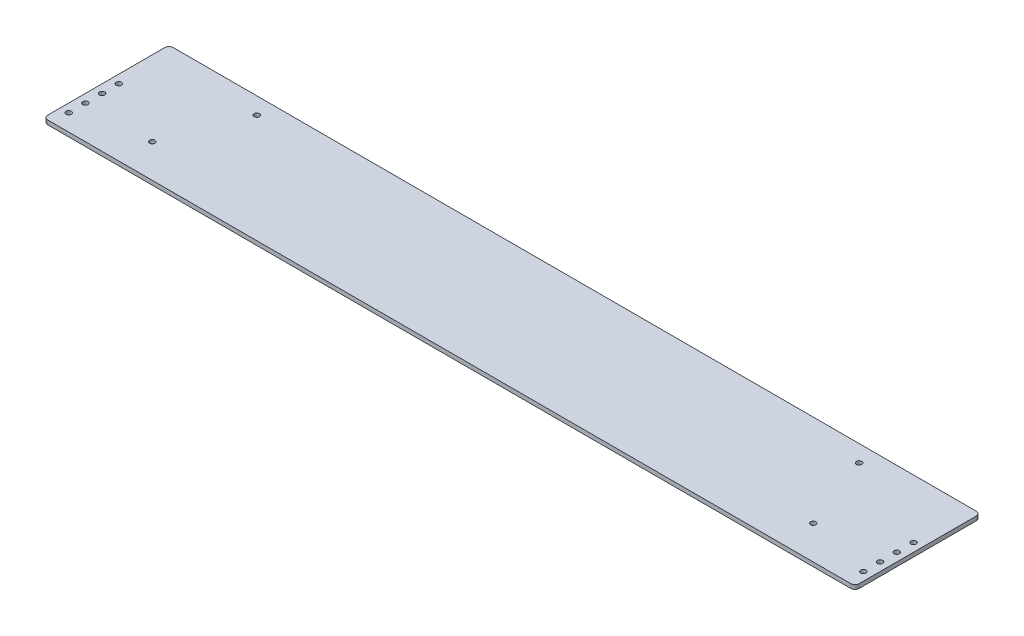
ISO-10303-21;
HEADER;
FILE_DESCRIPTION(('STEP AP214'),'2;1');
FILE_NAME('part.step','',(''),(''),'','','');
FILE_SCHEMA(('AUTOMOTIVE_DESIGN { 1 0 10303 214 1 1 1 1 }'));
ENDSEC;
DATA;
#1=APPLICATION_CONTEXT('core data for automotive mechanical design processes');
#2=APPLICATION_PROTOCOL_DEFINITION('international standard','automotive_design',2000,#1);
#3=PRODUCT_CONTEXT('',#1,'mechanical');
#4=PRODUCT('Part','Part','',(#3));
#5=PRODUCT_RELATED_PRODUCT_CATEGORY('part','',(#4));
#6=PRODUCT_DEFINITION_FORMATION('','',#4);
#7=PRODUCT_DEFINITION_CONTEXT('part definition',#1,'design');
#8=PRODUCT_DEFINITION('design','',#6,#7);
#9=PRODUCT_DEFINITION_SHAPE('','',#8);
#10=(LENGTH_UNIT() NAMED_UNIT(*) SI_UNIT(.MILLI.,.METRE.));
#11=(NAMED_UNIT(*) PLANE_ANGLE_UNIT() SI_UNIT($,.RADIAN.));
#12=(NAMED_UNIT(*) SI_UNIT($,.STERADIAN.) SOLID_ANGLE_UNIT());
#13=UNCERTAINTY_MEASURE_WITH_UNIT(LENGTH_MEASURE(1.E-05),#10,'distance_accuracy_value','');
#14=(GEOMETRIC_REPRESENTATION_CONTEXT(3) GLOBAL_UNCERTAINTY_ASSIGNED_CONTEXT((#13)) GLOBAL_UNIT_ASSIGNED_CONTEXT((#10,
#11,#12)) REPRESENTATION_CONTEXT('',''));
#15=CARTESIAN_POINT('',(0.,0.,0.));
#16=DIRECTION('',(0.,0.,1.));
#17=DIRECTION('',(1.,0.,0.));
#18=AXIS2_PLACEMENT_3D('',#15,#16,#17);
#19=CARTESIAN_POINT('',(0.,3.175,0.));
#20=DIRECTION('',(0.,-1.,0.));
#21=DIRECTION('',(0.,0.,-1.));
#22=AXIS2_PLACEMENT_3D('',#19,#20,#21);
#23=PLANE('',#22);
#24=CARTESIAN_POINT('',(228.6,3.175,-34.9250000000001));
#25=DIRECTION('',(0.,1.,0.));
#26=DIRECTION('',(0.,0.,-1.));
#27=AXIS2_PLACEMENT_3D('',#24,#25,#26);
#28=CIRCLE('',#27,2.01930000000001);
#29=CARTESIAN_POINT('',(228.6,3.175,-36.9443000000001));
#30=VERTEX_POINT('',#29);
#31=EDGE_CURVE('E289',#30,#30,#28,.T.);
#32=ORIENTED_EDGE('',*,*,#31,.F.);
#33=EDGE_LOOP('',(#32));
#34=FACE_BOUND('',#33,.T.);
#35=CARTESIAN_POINT('',(250.825,3.175,22.2249999999999));
#36=DIRECTION('',(0.,1.,0.));
#37=DIRECTION('',(0.,0.,-1.));
#38=AXIS2_PLACEMENT_3D('',#35,#36,#37);
#39=CIRCLE('',#38,2.01929999999998);
#40=CARTESIAN_POINT('',(250.825,3.175,20.2057));
#41=VERTEX_POINT('',#40);
#42=EDGE_CURVE('E297',#41,#41,#39,.T.);
#43=ORIENTED_EDGE('',*,*,#42,.F.);
#44=EDGE_LOOP('',(#43));
#45=FACE_BOUND('',#44,.T.);
#46=CARTESIAN_POINT('',(-250.825,3.175,22.225));
#47=DIRECTION('',(0.,1.,0.));
#48=DIRECTION('',(0.,0.,1.));
#49=AXIS2_PLACEMENT_3D('',#46,#47,#48);
#50=CIRCLE('',#49,2.01930000000001);
#51=CARTESIAN_POINT('',(-250.825,3.175,24.2443));
#52=VERTEX_POINT('',#51);
#53=EDGE_CURVE('E281',#52,#52,#50,.T.);
#54=ORIENTED_EDGE('',*,*,#53,.F.);
#55=EDGE_LOOP('',(#54));
#56=FACE_BOUND('',#55,.T.);
#57=CARTESIAN_POINT('',(-228.6,3.175,-34.925));
#58=DIRECTION('',(0.,1.,0.));
#59=DIRECTION('',(0.,0.,1.));
#60=AXIS2_PLACEMENT_3D('',#57,#58,#59);
#61=CIRCLE('',#60,2.01930000000001);
#62=CARTESIAN_POINT('',(-228.6,3.175,-32.9057));
#63=VERTEX_POINT('',#62);
#64=EDGE_CURVE('E277',#63,#63,#61,.T.);
#65=ORIENTED_EDGE('',*,*,#64,.F.);
#66=EDGE_LOOP('',(#65));
#67=FACE_BOUND('',#66,.T.);
#68=DIRECTION('',(1.,0.,0.));
#69=VECTOR('',#68,1.);
#70=CARTESIAN_POINT('',(-307.975,3.175,47.625));
#71=LINE('',#70,#69);
#72=CARTESIAN_POINT('',(-304.8,3.175,47.625));
#73=VERTEX_POINT('',#72);
#74=CARTESIAN_POINT('',(304.8,3.175,47.6249999999999));
#75=VERTEX_POINT('',#74);
#76=EDGE_CURVE('E155',#73,#75,#71,.T.);
#77=ORIENTED_EDGE('',*,*,#76,.T.);
#78=CARTESIAN_POINT('',(304.8,3.175,44.4499999999999));
#79=DIRECTION('',(0.,-1.,0.));
#80=DIRECTION('',(0.,0.,-1.));
#81=AXIS2_PLACEMENT_3D('',#78,#79,#80);
#82=CIRCLE('',#81,3.175);
#83=CARTESIAN_POINT('',(307.975,3.175,44.4499999999999));
#84=VERTEX_POINT('',#83);
#85=EDGE_CURVE('E184',#75,#84,#82,.F.);
#86=ORIENTED_EDGE('',*,*,#85,.T.);
#87=DIRECTION('',(0.,0.,-1.));
#88=VECTOR('',#87,1.);
#89=CARTESIAN_POINT('',(307.975,3.175,47.6249999999999));
#90=LINE('',#89,#88);
#91=CARTESIAN_POINT('',(307.975,3.175,-44.45));
#92=VERTEX_POINT('',#91);
#93=EDGE_CURVE('E133',#84,#92,#90,.T.);
#94=ORIENTED_EDGE('',*,*,#93,.T.);
#95=CARTESIAN_POINT('',(304.8,3.175,-44.45));
#96=DIRECTION('',(0.,-1.,0.));
#97=DIRECTION('',(0.,0.,-1.));
#98=AXIS2_PLACEMENT_3D('',#95,#96,#97);
#99=CIRCLE('',#98,3.175);
#100=CARTESIAN_POINT('',(304.8,3.175,-47.625));
#101=VERTEX_POINT('',#100);
#102=EDGE_CURVE('E179',#92,#101,#99,.F.);
#103=ORIENTED_EDGE('',*,*,#102,.T.);
#104=DIRECTION('',(-1.,0.,0.));
#105=VECTOR('',#104,1.);
#106=CARTESIAN_POINT('',(-307.975,3.175,-47.625));
#107=LINE('',#106,#105);
#108=CARTESIAN_POINT('',(-304.8,3.175,-47.625));
#109=VERTEX_POINT('',#108);
#110=EDGE_CURVE('E199',#101,#109,#107,.T.);
#111=ORIENTED_EDGE('',*,*,#110,.T.);
#112=CARTESIAN_POINT('',(-304.8,3.175,-44.45));
#113=DIRECTION('',(0.,-1.,0.));
#114=DIRECTION('',(0.,0.,-1.));
#115=AXIS2_PLACEMENT_3D('',#112,#113,#114);
#116=CIRCLE('',#115,3.175);
#117=CARTESIAN_POINT('',(-307.975,3.175,-44.45));
#118=VERTEX_POINT('',#117);
#119=EDGE_CURVE('E68',#109,#118,#116,.F.);
#120=ORIENTED_EDGE('',*,*,#119,.T.);
#121=DIRECTION('',(0.,0.,1.));
#122=VECTOR('',#121,1.);
#123=CARTESIAN_POINT('',(-307.975,3.175,47.625));
#124=LINE('',#123,#122);
#125=CARTESIAN_POINT('',(-307.975,3.175,44.45));
#126=VERTEX_POINT('',#125);
#127=EDGE_CURVE('E207',#118,#126,#124,.T.);
#128=ORIENTED_EDGE('',*,*,#127,.T.);
#129=CARTESIAN_POINT('',(-304.8,3.175,44.45));
#130=DIRECTION('',(0.,-1.,0.));
#131=DIRECTION('',(0.,0.,-1.));
#132=AXIS2_PLACEMENT_3D('',#129,#130,#131);
#133=CIRCLE('',#132,3.175);
#134=EDGE_CURVE('E176',#126,#73,#133,.F.);
#135=ORIENTED_EDGE('',*,*,#134,.T.);
#136=EDGE_LOOP('',(#77,#86,#94,#103,#111,#120,#128,#135));
#137=FACE_BOUND('',#136,.T.);
#138=CARTESIAN_POINT('',(-301.625,3.175,-3.17500000000002));
#139=DIRECTION('',(0.,1.,0.));
#140=DIRECTION('',(0.,0.,1.));
#141=AXIS2_PLACEMENT_3D('',#138,#139,#140);
#142=CIRCLE('',#141,2.01929999999998);
#143=CARTESIAN_POINT('',(-301.625,3.175,-1.15570000000004));
#144=VERTEX_POINT('',#143);
#145=EDGE_CURVE('E144',#144,#144,#142,.T.);
#146=ORIENTED_EDGE('',*,*,#145,.F.);
#147=EDGE_LOOP('',(#146));
#148=FACE_BOUND('',#147,.T.);
#149=CARTESIAN_POINT('',(-301.625,3.175,9.52499999999998));
#150=DIRECTION('',(0.,1.,0.));
#151=DIRECTION('',(0.,0.,1.));
#152=AXIS2_PLACEMENT_3D('',#149,#150,#151);
#153=CIRCLE('',#152,2.01929999999998);
#154=CARTESIAN_POINT('',(-301.625,3.175,11.5443));
#155=VERTEX_POINT('',#154);
#156=EDGE_CURVE('E219',#155,#155,#153,.T.);
#157=ORIENTED_EDGE('',*,*,#156,.F.);
#158=EDGE_LOOP('',(#157));
#159=FACE_BOUND('',#158,.T.);
#160=CARTESIAN_POINT('',(-301.625,3.175,22.225));
#161=DIRECTION('',(0.,1.,0.));
#162=DIRECTION('',(0.,0.,1.));
#163=AXIS2_PLACEMENT_3D('',#160,#161,#162);
#164=CIRCLE('',#163,2.01929999999998);
#165=CARTESIAN_POINT('',(-301.625,3.175,24.2443));
#166=VERTEX_POINT('',#165);
#167=EDGE_CURVE('E225',#166,#166,#164,.T.);
#168=ORIENTED_EDGE('',*,*,#167,.F.);
#169=EDGE_LOOP('',(#168));
#170=FACE_BOUND('',#169,.T.);
#171=CARTESIAN_POINT('',(-301.625,3.175,34.925));
#172=DIRECTION('',(0.,1.,0.));
#173=DIRECTION('',(0.,0.,1.));
#174=AXIS2_PLACEMENT_3D('',#171,#172,#173);
#175=CIRCLE('',#174,2.01929999999998);
#176=CARTESIAN_POINT('',(-301.625,3.175,36.9443));
#177=VERTEX_POINT('',#176);
#178=EDGE_CURVE('E233',#177,#177,#175,.T.);
#179=ORIENTED_EDGE('',*,*,#178,.F.);
#180=EDGE_LOOP('',(#179));
#181=FACE_BOUND('',#180,.T.);
#182=CARTESIAN_POINT('',(301.625,3.175,34.9249999999999));
#183=DIRECTION('',(0.,1.,0.));
#184=DIRECTION('',(0.,0.,-1.));
#185=AXIS2_PLACEMENT_3D('',#182,#183,#184);
#186=CIRCLE('',#185,2.01929999999998);
#187=CARTESIAN_POINT('',(301.625,3.175,32.9056999999999));
#188=VERTEX_POINT('',#187);
#189=EDGE_CURVE('E241',#188,#188,#186,.T.);
#190=ORIENTED_EDGE('',*,*,#189,.F.);
#191=EDGE_LOOP('',(#190));
#192=FACE_BOUND('',#191,.T.);
#193=CARTESIAN_POINT('',(301.625,3.175,22.2249999999999));
#194=DIRECTION('',(0.,1.,0.));
#195=DIRECTION('',(0.,0.,-1.));
#196=AXIS2_PLACEMENT_3D('',#193,#194,#195);
#197=CIRCLE('',#196,2.01929999999998);
#198=CARTESIAN_POINT('',(301.625,3.175,20.2056999999999));
#199=VERTEX_POINT('',#198);
#200=EDGE_CURVE('E249',#199,#199,#197,.T.);
#201=ORIENTED_EDGE('',*,*,#200,.F.);
#202=EDGE_LOOP('',(#201));
#203=FACE_BOUND('',#202,.T.);
#204=CARTESIAN_POINT('',(301.625,3.175,9.52499999999991));
#205=DIRECTION('',(0.,1.,0.));
#206=DIRECTION('',(0.,0.,-1.));
#207=AXIS2_PLACEMENT_3D('',#204,#205,#206);
#208=CIRCLE('',#207,2.01929999999998);
#209=CARTESIAN_POINT('',(301.625,3.175,7.50569999999993));
#210=VERTEX_POINT('',#209);
#211=EDGE_CURVE('E257',#210,#210,#208,.T.);
#212=ORIENTED_EDGE('',*,*,#211,.F.);
#213=EDGE_LOOP('',(#212));
#214=FACE_BOUND('',#213,.T.);
#215=CARTESIAN_POINT('',(301.625,3.175,-3.17500000000009));
#216=DIRECTION('',(0.,1.,0.));
#217=DIRECTION('',(0.,0.,-1.));
#218=AXIS2_PLACEMENT_3D('',#215,#216,#217);
#219=CIRCLE('',#218,2.01929999999998);
#220=CARTESIAN_POINT('',(301.625,3.175,-5.19430000000007));
#221=VERTEX_POINT('',#220);
#222=EDGE_CURVE('E265',#221,#221,#219,.T.);
#223=ORIENTED_EDGE('',*,*,#222,.F.);
#224=EDGE_LOOP('',(#223));
#225=FACE_BOUND('',#224,.T.);
#226=ADVANCED_FACE('F45',(#34,#45,#56,#67,#137,#148,#159,#170,#181,#192,#203,#214,#225),#23,.F.);
#227=CARTESIAN_POINT('',(0.,0.,0.));
#228=DIRECTION('',(0.,-1.,0.));
#229=DIRECTION('',(0.,0.,-1.));
#230=AXIS2_PLACEMENT_3D('',#227,#228,#229);
#231=PLANE('',#230);
#232=CARTESIAN_POINT('',(228.6,0.,-34.9250000000001));
#233=DIRECTION('',(0.,1.,0.));
#234=DIRECTION('',(0.,0.,-1.));
#235=AXIS2_PLACEMENT_3D('',#232,#233,#234);
#236=CIRCLE('',#235,2.01930000000001);
#237=CARTESIAN_POINT('',(228.6,0.,-36.9443000000001));
#238=VERTEX_POINT('',#237);
#239=EDGE_CURVE('E285',#238,#238,#236,.T.);
#240=ORIENTED_EDGE('',*,*,#239,.T.);
#241=EDGE_LOOP('',(#240));
#242=FACE_BOUND('',#241,.T.);
#243=CARTESIAN_POINT('',(250.825,0.,22.2249999999999));
#244=DIRECTION('',(0.,1.,0.));
#245=DIRECTION('',(0.,0.,-1.));
#246=AXIS2_PLACEMENT_3D('',#243,#244,#245);
#247=CIRCLE('',#246,2.01929999999998);
#248=CARTESIAN_POINT('',(250.825,0.,20.2057));
#249=VERTEX_POINT('',#248);
#250=EDGE_CURVE('E293',#249,#249,#247,.T.);
#251=ORIENTED_EDGE('',*,*,#250,.T.);
#252=EDGE_LOOP('',(#251));
#253=FACE_BOUND('',#252,.T.);
#254=CARTESIAN_POINT('',(-250.825,0.,22.225));
#255=DIRECTION('',(0.,1.,0.));
#256=DIRECTION('',(0.,0.,1.));
#257=AXIS2_PLACEMENT_3D('',#254,#255,#256);
#258=CIRCLE('',#257,2.01930000000001);
#259=CARTESIAN_POINT('',(-250.825,0.,24.2443));
#260=VERTEX_POINT('',#259);
#261=EDGE_CURVE('E301',#260,#260,#258,.T.);
#262=ORIENTED_EDGE('',*,*,#261,.T.);
#263=EDGE_LOOP('',(#262));
#264=FACE_BOUND('',#263,.T.);
#265=CARTESIAN_POINT('',(-228.6,0.,-34.925));
#266=DIRECTION('',(0.,1.,0.));
#267=DIRECTION('',(0.,0.,1.));
#268=AXIS2_PLACEMENT_3D('',#265,#266,#267);
#269=CIRCLE('',#268,2.01930000000001);
#270=CARTESIAN_POINT('',(-228.6,0.,-32.9057));
#271=VERTEX_POINT('',#270);
#272=EDGE_CURVE('E273',#271,#271,#269,.T.);
#273=ORIENTED_EDGE('',*,*,#272,.T.);
#274=EDGE_LOOP('',(#273));
#275=FACE_BOUND('',#274,.T.);
#276=CARTESIAN_POINT('',(301.625,0.,9.52499999999991));
#277=DIRECTION('',(0.,1.,0.));
#278=DIRECTION('',(0.,0.,-1.));
#279=AXIS2_PLACEMENT_3D('',#276,#277,#278);
#280=CIRCLE('',#279,2.01929999999998);
#281=CARTESIAN_POINT('',(301.625,0.,7.50569999999993));
#282=VERTEX_POINT('',#281);
#283=EDGE_CURVE('E261',#282,#282,#280,.T.);
#284=ORIENTED_EDGE('',*,*,#283,.T.);
#285=EDGE_LOOP('',(#284));
#286=FACE_BOUND('',#285,.T.);
#287=CARTESIAN_POINT('',(301.625,0.,34.9249999999999));
#288=DIRECTION('',(0.,1.,0.));
#289=DIRECTION('',(0.,0.,-1.));
#290=AXIS2_PLACEMENT_3D('',#287,#288,#289);
#291=CIRCLE('',#290,2.01929999999998);
#292=CARTESIAN_POINT('',(301.625,0.,32.9056999999999));
#293=VERTEX_POINT('',#292);
#294=EDGE_CURVE('E245',#293,#293,#291,.T.);
#295=ORIENTED_EDGE('',*,*,#294,.T.);
#296=EDGE_LOOP('',(#295));
#297=FACE_BOUND('',#296,.T.);
#298=CARTESIAN_POINT('',(-301.625,0.,22.225));
#299=DIRECTION('',(0.,1.,0.));
#300=DIRECTION('',(0.,0.,1.));
#301=AXIS2_PLACEMENT_3D('',#298,#299,#300);
#302=CIRCLE('',#301,2.01929999999998);
#303=CARTESIAN_POINT('',(-301.625,0.,24.2443));
#304=VERTEX_POINT('',#303);
#305=EDGE_CURVE('E229',#304,#304,#302,.T.);
#306=ORIENTED_EDGE('',*,*,#305,.T.);
#307=EDGE_LOOP('',(#306));
#308=FACE_BOUND('',#307,.T.);
#309=CARTESIAN_POINT('',(-301.625,0.,-3.17500000000002));
#310=DIRECTION('',(0.,1.,0.));
#311=DIRECTION('',(0.,0.,1.));
#312=AXIS2_PLACEMENT_3D('',#309,#310,#311);
#313=CIRCLE('',#312,2.01929999999998);
#314=CARTESIAN_POINT('',(-301.625,0.,-1.15570000000004));
#315=VERTEX_POINT('',#314);
#316=EDGE_CURVE('E152',#315,#315,#313,.T.);
#317=ORIENTED_EDGE('',*,*,#316,.T.);
#318=EDGE_LOOP('',(#317));
#319=FACE_BOUND('',#318,.T.);
#320=DIRECTION('',(0.,0.,-1.));
#321=VECTOR('',#320,1.);
#322=CARTESIAN_POINT('',(307.975,0.,47.6249999999999));
#323=LINE('',#322,#321);
#324=CARTESIAN_POINT('',(307.975,0.,44.4499999999999));
#325=VERTEX_POINT('',#324);
#326=CARTESIAN_POINT('',(307.975,0.,-44.45));
#327=VERTEX_POINT('',#326);
#328=EDGE_CURVE('E130',#325,#327,#323,.T.);
#329=ORIENTED_EDGE('',*,*,#328,.F.);
#330=CARTESIAN_POINT('',(304.8,0.,44.4499999999999));
#331=DIRECTION('',(0.,-1.,0.));
#332=DIRECTION('',(0.,0.,-1.));
#333=AXIS2_PLACEMENT_3D('',#330,#331,#332);
#334=CIRCLE('',#333,3.175);
#335=CARTESIAN_POINT('',(304.8,0.,47.6249999999999));
#336=VERTEX_POINT('',#335);
#337=EDGE_CURVE('E112',#325,#336,#334,.T.);
#338=ORIENTED_EDGE('',*,*,#337,.T.);
#339=DIRECTION('',(1.,0.,0.));
#340=VECTOR('',#339,1.);
#341=CARTESIAN_POINT('',(-307.975,0.,47.625));
#342=LINE('',#341,#340);
#343=CARTESIAN_POINT('',(-304.8,0.,47.625));
#344=VERTEX_POINT('',#343);
#345=EDGE_CURVE('E160',#344,#336,#342,.T.);
#346=ORIENTED_EDGE('',*,*,#345,.F.);
#347=CARTESIAN_POINT('',(-304.8,0.,44.45));
#348=DIRECTION('',(0.,-1.,0.));
#349=DIRECTION('',(0.,0.,-1.));
#350=AXIS2_PLACEMENT_3D('',#347,#348,#349);
#351=CIRCLE('',#350,3.175);
#352=CARTESIAN_POINT('',(-307.975,0.,44.45));
#353=VERTEX_POINT('',#352);
#354=EDGE_CURVE('E135',#344,#353,#351,.T.);
#355=ORIENTED_EDGE('',*,*,#354,.T.);
#356=DIRECTION('',(0.,0.,1.));
#357=VECTOR('',#356,1.);
#358=CARTESIAN_POINT('',(-307.975,0.,47.625));
#359=LINE('',#358,#357);
#360=CARTESIAN_POINT('',(-307.975,0.,-44.45));
#361=VERTEX_POINT('',#360);
#362=EDGE_CURVE('E149',#361,#353,#359,.T.);
#363=ORIENTED_EDGE('',*,*,#362,.F.);
#364=CARTESIAN_POINT('',(-304.8,0.,-44.45));
#365=DIRECTION('',(0.,-1.,0.));
#366=DIRECTION('',(0.,0.,-1.));
#367=AXIS2_PLACEMENT_3D('',#364,#365,#366);
#368=CIRCLE('',#367,3.175);
#369=CARTESIAN_POINT('',(-304.8,0.,-47.625));
#370=VERTEX_POINT('',#369);
#371=EDGE_CURVE('E124',#361,#370,#368,.T.);
#372=ORIENTED_EDGE('',*,*,#371,.T.);
#373=DIRECTION('',(-1.,0.,0.));
#374=VECTOR('',#373,1.);
#375=CARTESIAN_POINT('',(-307.975,0.,-47.625));
#376=LINE('',#375,#374);
#377=CARTESIAN_POINT('',(304.8,0.,-47.625));
#378=VERTEX_POINT('',#377);
#379=EDGE_CURVE('E143',#378,#370,#376,.T.);
#380=ORIENTED_EDGE('',*,*,#379,.F.);
#381=CARTESIAN_POINT('',(304.8,0.,-44.45));
#382=DIRECTION('',(0.,-1.,0.));
#383=DIRECTION('',(0.,0.,-1.));
#384=AXIS2_PLACEMENT_3D('',#381,#382,#383);
#385=CIRCLE('',#384,3.175);
#386=EDGE_CURVE('E141',#378,#327,#385,.T.);
#387=ORIENTED_EDGE('',*,*,#386,.T.);
#388=EDGE_LOOP('',(#329,#338,#346,#355,#363,#372,#380,#387));
#389=FACE_BOUND('',#388,.T.);
#390=CARTESIAN_POINT('',(-301.625,0.,9.52499999999998));
#391=DIRECTION('',(0.,1.,0.));
#392=DIRECTION('',(0.,0.,1.));
#393=AXIS2_PLACEMENT_3D('',#390,#391,#392);
#394=CIRCLE('',#393,2.01929999999998);
#395=CARTESIAN_POINT('',(-301.625,0.,11.5443));
#396=VERTEX_POINT('',#395);
#397=EDGE_CURVE('E221',#396,#396,#394,.T.);
#398=ORIENTED_EDGE('',*,*,#397,.T.);
#399=EDGE_LOOP('',(#398));
#400=FACE_BOUND('',#399,.T.);
#401=CARTESIAN_POINT('',(-301.625,0.,34.925));
#402=DIRECTION('',(0.,1.,0.));
#403=DIRECTION('',(0.,0.,1.));
#404=AXIS2_PLACEMENT_3D('',#401,#402,#403);
#405=CIRCLE('',#404,2.01929999999998);
#406=CARTESIAN_POINT('',(-301.625,0.,36.9443));
#407=VERTEX_POINT('',#406);
#408=EDGE_CURVE('E237',#407,#407,#405,.T.);
#409=ORIENTED_EDGE('',*,*,#408,.T.);
#410=EDGE_LOOP('',(#409));
#411=FACE_BOUND('',#410,.T.);
#412=CARTESIAN_POINT('',(301.625,0.,22.2249999999999));
#413=DIRECTION('',(0.,1.,0.));
#414=DIRECTION('',(0.,0.,-1.));
#415=AXIS2_PLACEMENT_3D('',#412,#413,#414);
#416=CIRCLE('',#415,2.01929999999998);
#417=CARTESIAN_POINT('',(301.625,0.,20.2056999999999));
#418=VERTEX_POINT('',#417);
#419=EDGE_CURVE('E253',#418,#418,#416,.T.);
#420=ORIENTED_EDGE('',*,*,#419,.T.);
#421=EDGE_LOOP('',(#420));
#422=FACE_BOUND('',#421,.T.);
#423=CARTESIAN_POINT('',(301.625,0.,-3.17500000000009));
#424=DIRECTION('',(0.,1.,0.));
#425=DIRECTION('',(0.,0.,-1.));
#426=AXIS2_PLACEMENT_3D('',#423,#424,#425);
#427=CIRCLE('',#426,2.01929999999998);
#428=CARTESIAN_POINT('',(301.625,0.,-5.19430000000007));
#429=VERTEX_POINT('',#428);
#430=EDGE_CURVE('E269',#429,#429,#427,.T.);
#431=ORIENTED_EDGE('',*,*,#430,.T.);
#432=EDGE_LOOP('',(#431));
#433=FACE_BOUND('',#432,.T.);
#434=ADVANCED_FACE('F138',(#242,#253,#264,#275,#286,#297,#308,#319,#389,#400,#411,#422,#433),
#231,.T.);
#435=CARTESIAN_POINT('',(307.975,3.175,47.6249999999999));
#436=DIRECTION('',(-1.,0.,0.));
#437=DIRECTION('',(0.,0.,1.));
#438=AXIS2_PLACEMENT_3D('',#435,#436,#437);
#439=PLANE('',#438);
#440=ORIENTED_EDGE('',*,*,#93,.F.);
#441=DIRECTION('',(0.,-1.,0.));
#442=VECTOR('',#441,1.);
#443=CARTESIAN_POINT('',(307.975,3.175,44.4499999999999));
#444=LINE('',#443,#442);
#445=EDGE_CURVE('E116',#84,#325,#444,.T.);
#446=ORIENTED_EDGE('',*,*,#445,.T.);
#447=ORIENTED_EDGE('',*,*,#328,.T.);
#448=DIRECTION('',(0.,-1.,0.));
#449=VECTOR('',#448,1.);
#450=CARTESIAN_POINT('',(307.975,3.175,-44.45));
#451=LINE('',#450,#449);
#452=EDGE_CURVE('E136',#327,#92,#451,.F.);
#453=ORIENTED_EDGE('',*,*,#452,.T.);
#454=EDGE_LOOP('',(#440,#446,#447,#453));
#455=FACE_BOUND('',#454,.T.);
#456=ADVANCED_FACE('F129',(#455),#439,.F.);
#457=CARTESIAN_POINT('',(-307.975,3.175,-47.625));
#458=DIRECTION('',(0.,0.,1.));
#459=DIRECTION('',(1.,0.,0.));
#460=AXIS2_PLACEMENT_3D('',#457,#458,#459);
#461=PLANE('',#460);
#462=ORIENTED_EDGE('',*,*,#379,.T.);
#463=DIRECTION('',(0.,-1.,0.));
#464=VECTOR('',#463,1.);
#465=CARTESIAN_POINT('',(-304.8,3.175,-47.625));
#466=LINE('',#465,#464);
#467=EDGE_CURVE('E11',#370,#109,#466,.F.);
#468=ORIENTED_EDGE('',*,*,#467,.T.);
#469=ORIENTED_EDGE('',*,*,#110,.F.);
#470=DIRECTION('',(0.,-1.,0.));
#471=VECTOR('',#470,1.);
#472=CARTESIAN_POINT('',(304.8,3.175,-47.625));
#473=LINE('',#472,#471);
#474=EDGE_CURVE('E54',#101,#378,#473,.T.);
#475=ORIENTED_EDGE('',*,*,#474,.T.);
#476=EDGE_LOOP('',(#462,#468,#469,#475));
#477=FACE_BOUND('',#476,.T.);
#478=ADVANCED_FACE('F197',(#477),#461,.F.);
#479=CARTESIAN_POINT('',(-307.975,3.175,47.625));
#480=DIRECTION('',(1.,0.,0.));
#481=DIRECTION('',(0.,0.,-1.));
#482=AXIS2_PLACEMENT_3D('',#479,#480,#481);
#483=PLANE('',#482);
#484=ORIENTED_EDGE('',*,*,#127,.F.);
#485=DIRECTION('',(0.,-1.,0.));
#486=VECTOR('',#485,1.);
#487=CARTESIAN_POINT('',(-307.975,3.175,-44.45));
#488=LINE('',#487,#486);
#489=EDGE_CURVE('E189',#118,#361,#488,.T.);
#490=ORIENTED_EDGE('',*,*,#489,.T.);
#491=ORIENTED_EDGE('',*,*,#362,.T.);
#492=DIRECTION('',(0.,-1.,0.));
#493=VECTOR('',#492,1.);
#494=CARTESIAN_POINT('',(-307.975,3.175,44.45));
#495=LINE('',#494,#493);
#496=EDGE_CURVE('E61',#353,#126,#495,.F.);
#497=ORIENTED_EDGE('',*,*,#496,.T.);
#498=EDGE_LOOP('',(#484,#490,#491,#497));
#499=FACE_BOUND('',#498,.T.);
#500=ADVANCED_FACE('F206',(#499),#483,.F.);
#501=CARTESIAN_POINT('',(-307.975,3.175,47.625));
#502=DIRECTION('',(0.,0.,-1.));
#503=DIRECTION('',(-1.,0.,0.));
#504=AXIS2_PLACEMENT_3D('',#501,#502,#503);
#505=PLANE('',#504);
#506=ORIENTED_EDGE('',*,*,#345,.T.);
#507=DIRECTION('',(0.,-1.,0.));
#508=VECTOR('',#507,1.);
#509=CARTESIAN_POINT('',(304.8,3.175,47.6249999999999));
#510=LINE('',#509,#508);
#511=EDGE_CURVE('E117',#336,#75,#510,.F.);
#512=ORIENTED_EDGE('',*,*,#511,.T.);
#513=ORIENTED_EDGE('',*,*,#76,.F.);
#514=DIRECTION('',(0.,-1.,0.));
#515=VECTOR('',#514,1.);
#516=CARTESIAN_POINT('',(-304.8,3.175,47.625));
#517=LINE('',#516,#515);
#518=EDGE_CURVE('E123',#73,#344,#517,.T.);
#519=ORIENTED_EDGE('',*,*,#518,.T.);
#520=EDGE_LOOP('',(#506,#512,#513,#519));
#521=FACE_BOUND('',#520,.T.);
#522=ADVANCED_FACE('F352',(#521),#505,.F.);
#523=CARTESIAN_POINT('',(-301.625,3.175,-3.17500000000002));
#524=DIRECTION('',(0.,-1.,0.));
#525=DIRECTION('',(0.,0.,-1.));
#526=AXIS2_PLACEMENT_3D('',#523,#524,#525);
#527=CYLINDRICAL_SURFACE('',#526,2.01929999999998);
#528=ORIENTED_EDGE('',*,*,#145,.T.);
#529=EDGE_LOOP('',(#528));
#530=FACE_BOUND('',#529,.T.);
#531=ORIENTED_EDGE('',*,*,#316,.F.);
#532=EDGE_LOOP('',(#531));
#533=FACE_BOUND('',#532,.T.);
#534=ADVANCED_FACE('F355',(#530,#533),#527,.F.);
#535=CARTESIAN_POINT('',(-301.625,3.175,9.52499999999998));
#536=DIRECTION('',(0.,-1.,0.));
#537=DIRECTION('',(0.,0.,-1.));
#538=AXIS2_PLACEMENT_3D('',#535,#536,#537);
#539=CYLINDRICAL_SURFACE('',#538,2.01929999999998);
#540=ORIENTED_EDGE('',*,*,#156,.T.);
#541=EDGE_LOOP('',(#540));
#542=FACE_BOUND('',#541,.T.);
#543=ORIENTED_EDGE('',*,*,#397,.F.);
#544=EDGE_LOOP('',(#543));
#545=FACE_BOUND('',#544,.T.);
#546=ADVANCED_FACE('F406',(#542,#545),#539,.F.);
#547=CARTESIAN_POINT('',(-301.625,3.175,22.225));
#548=DIRECTION('',(0.,-1.,0.));
#549=DIRECTION('',(0.,0.,-1.));
#550=AXIS2_PLACEMENT_3D('',#547,#548,#549);
#551=CYLINDRICAL_SURFACE('',#550,2.01929999999998);
#552=ORIENTED_EDGE('',*,*,#167,.T.);
#553=EDGE_LOOP('',(#552));
#554=FACE_BOUND('',#553,.T.);
#555=ORIENTED_EDGE('',*,*,#305,.F.);
#556=EDGE_LOOP('',(#555));
#557=FACE_BOUND('',#556,.T.);
#558=ADVANCED_FACE('F402',(#554,#557),#551,.F.);
#559=CARTESIAN_POINT('',(-301.625,3.175,34.925));
#560=DIRECTION('',(0.,-1.,0.));
#561=DIRECTION('',(0.,0.,-1.));
#562=AXIS2_PLACEMENT_3D('',#559,#560,#561);
#563=CYLINDRICAL_SURFACE('',#562,2.01929999999998);
#564=ORIENTED_EDGE('',*,*,#178,.T.);
#565=EDGE_LOOP('',(#564));
#566=FACE_BOUND('',#565,.T.);
#567=ORIENTED_EDGE('',*,*,#408,.F.);
#568=EDGE_LOOP('',(#567));
#569=FACE_BOUND('',#568,.T.);
#570=ADVANCED_FACE('F398',(#566,#569),#563,.F.);
#571=CARTESIAN_POINT('',(301.625,3.175,34.9249999999999));
#572=DIRECTION('',(0.,-1.,0.));
#573=DIRECTION('',(0.,0.,-1.));
#574=AXIS2_PLACEMENT_3D('',#571,#572,#573);
#575=CYLINDRICAL_SURFACE('',#574,2.01929999999998);
#576=ORIENTED_EDGE('',*,*,#189,.T.);
#577=EDGE_LOOP('',(#576));
#578=FACE_BOUND('',#577,.T.);
#579=ORIENTED_EDGE('',*,*,#294,.F.);
#580=EDGE_LOOP('',(#579));
#581=FACE_BOUND('',#580,.T.);
#582=ADVANCED_FACE('F394',(#578,#581),#575,.F.);
#583=CARTESIAN_POINT('',(301.625,3.175,22.2249999999999));
#584=DIRECTION('',(0.,-1.,0.));
#585=DIRECTION('',(0.,0.,-1.));
#586=AXIS2_PLACEMENT_3D('',#583,#584,#585);
#587=CYLINDRICAL_SURFACE('',#586,2.01929999999998);
#588=ORIENTED_EDGE('',*,*,#200,.T.);
#589=EDGE_LOOP('',(#588));
#590=FACE_BOUND('',#589,.T.);
#591=ORIENTED_EDGE('',*,*,#419,.F.);
#592=EDGE_LOOP('',(#591));
#593=FACE_BOUND('',#592,.T.);
#594=ADVANCED_FACE('F390',(#590,#593),#587,.F.);
#595=CARTESIAN_POINT('',(301.625,3.175,9.52499999999991));
#596=DIRECTION('',(0.,-1.,0.));
#597=DIRECTION('',(0.,0.,-1.));
#598=AXIS2_PLACEMENT_3D('',#595,#596,#597);
#599=CYLINDRICAL_SURFACE('',#598,2.01929999999998);
#600=ORIENTED_EDGE('',*,*,#211,.T.);
#601=EDGE_LOOP('',(#600));
#602=FACE_BOUND('',#601,.T.);
#603=ORIENTED_EDGE('',*,*,#283,.F.);
#604=EDGE_LOOP('',(#603));
#605=FACE_BOUND('',#604,.T.);
#606=ADVANCED_FACE('F337',(#602,#605),#599,.F.);
#607=CARTESIAN_POINT('',(301.625,3.175,-3.17500000000009));
#608=DIRECTION('',(0.,-1.,0.));
#609=DIRECTION('',(0.,0.,-1.));
#610=AXIS2_PLACEMENT_3D('',#607,#608,#609);
#611=CYLINDRICAL_SURFACE('',#610,2.01929999999998);
#612=ORIENTED_EDGE('',*,*,#222,.T.);
#613=EDGE_LOOP('',(#612));
#614=FACE_BOUND('',#613,.T.);
#615=ORIENTED_EDGE('',*,*,#430,.F.);
#616=EDGE_LOOP('',(#615));
#617=FACE_BOUND('',#616,.T.);
#618=ADVANCED_FACE('F334',(#614,#617),#611,.F.);
#619=CARTESIAN_POINT('',(304.8,3.175,44.4499999999999));
#620=DIRECTION('',(0.,-1.,0.));
#621=DIRECTION('',(0.,0.,-1.));
#622=AXIS2_PLACEMENT_3D('',#619,#620,#621);
#623=CYLINDRICAL_SURFACE('',#622,3.175);
#624=ORIENTED_EDGE('',*,*,#85,.F.);
#625=ORIENTED_EDGE('',*,*,#511,.F.);
#626=ORIENTED_EDGE('',*,*,#337,.F.);
#627=ORIENTED_EDGE('',*,*,#445,.F.);
#628=EDGE_LOOP('',(#624,#625,#626,#627));
#629=FACE_BOUND('',#628,.T.);
#630=ADVANCED_FACE('F115',(#629),#623,.T.);
#631=CARTESIAN_POINT('',(-304.8,3.175,-44.45));
#632=DIRECTION('',(0.,-1.,0.));
#633=DIRECTION('',(0.,0.,-1.));
#634=AXIS2_PLACEMENT_3D('',#631,#632,#633);
#635=CYLINDRICAL_SURFACE('',#634,3.175);
#636=ORIENTED_EDGE('',*,*,#119,.F.);
#637=ORIENTED_EDGE('',*,*,#467,.F.);
#638=ORIENTED_EDGE('',*,*,#371,.F.);
#639=ORIENTED_EDGE('',*,*,#489,.F.);
#640=EDGE_LOOP('',(#636,#637,#638,#639));
#641=FACE_BOUND('',#640,.T.);
#642=ADVANCED_FACE('F205',(#641),#635,.T.);
#643=CARTESIAN_POINT('',(304.8,3.175,-44.45));
#644=DIRECTION('',(0.,-1.,0.));
#645=DIRECTION('',(0.,0.,-1.));
#646=AXIS2_PLACEMENT_3D('',#643,#644,#645);
#647=CYLINDRICAL_SURFACE('',#646,3.175);
#648=ORIENTED_EDGE('',*,*,#102,.F.);
#649=ORIENTED_EDGE('',*,*,#452,.F.);
#650=ORIENTED_EDGE('',*,*,#386,.F.);
#651=ORIENTED_EDGE('',*,*,#474,.F.);
#652=EDGE_LOOP('',(#648,#649,#650,#651));
#653=FACE_BOUND('',#652,.T.);
#654=ADVANCED_FACE('F364',(#653),#647,.T.);
#655=CARTESIAN_POINT('',(-304.8,3.175,44.45));
#656=DIRECTION('',(0.,-1.,0.));
#657=DIRECTION('',(0.,0.,-1.));
#658=AXIS2_PLACEMENT_3D('',#655,#656,#657);
#659=CYLINDRICAL_SURFACE('',#658,3.175);
#660=ORIENTED_EDGE('',*,*,#134,.F.);
#661=ORIENTED_EDGE('',*,*,#496,.F.);
#662=ORIENTED_EDGE('',*,*,#354,.F.);
#663=ORIENTED_EDGE('',*,*,#518,.F.);
#664=EDGE_LOOP('',(#660,#661,#662,#663));
#665=FACE_BOUND('',#664,.T.);
#666=ADVANCED_FACE('F47',(#665),#659,.T.);
#667=CARTESIAN_POINT('',(-228.6,0.,-34.925));
#668=DIRECTION('',(0.,1.,0.));
#669=DIRECTION('',(0.,0.,1.));
#670=AXIS2_PLACEMENT_3D('',#667,#668,#669);
#671=CYLINDRICAL_SURFACE('',#670,2.01930000000001);
#672=ORIENTED_EDGE('',*,*,#272,.F.);
#673=EDGE_LOOP('',(#672));
#674=FACE_BOUND('',#673,.T.);
#675=ORIENTED_EDGE('',*,*,#64,.T.);
#676=EDGE_LOOP('',(#675));
#677=FACE_BOUND('',#676,.T.);
#678=ADVANCED_FACE('F369',(#674,#677),#671,.F.);
#679=CARTESIAN_POINT('',(-250.825,0.,22.225));
#680=DIRECTION('',(0.,1.,0.));
#681=DIRECTION('',(0.,0.,1.));
#682=AXIS2_PLACEMENT_3D('',#679,#680,#681);
#683=CYLINDRICAL_SURFACE('',#682,2.01930000000001);
#684=ORIENTED_EDGE('',*,*,#261,.F.);
#685=EDGE_LOOP('',(#684));
#686=FACE_BOUND('',#685,.T.);
#687=ORIENTED_EDGE('',*,*,#53,.T.);
#688=EDGE_LOOP('',(#687));
#689=FACE_BOUND('',#688,.T.);
#690=ADVANCED_FACE('F309',(#686,#689),#683,.F.);
#691=CARTESIAN_POINT('',(250.825,0.,22.2249999999999));
#692=DIRECTION('',(0.,1.,0.));
#693=DIRECTION('',(0.,0.,1.));
#694=AXIS2_PLACEMENT_3D('',#691,#692,#693);
#695=CYLINDRICAL_SURFACE('',#694,2.01929999999998);
#696=ORIENTED_EDGE('',*,*,#250,.F.);
#697=EDGE_LOOP('',(#696));
#698=FACE_BOUND('',#697,.T.);
#699=ORIENTED_EDGE('',*,*,#42,.T.);
#700=EDGE_LOOP('',(#699));
#701=FACE_BOUND('',#700,.T.);
#702=ADVANCED_FACE('F379',(#698,#701),#695,.F.);
#703=CARTESIAN_POINT('',(228.6,0.,-34.9250000000001));
#704=DIRECTION('',(0.,1.,0.));
#705=DIRECTION('',(0.,0.,1.));
#706=AXIS2_PLACEMENT_3D('',#703,#704,#705);
#707=CYLINDRICAL_SURFACE('',#706,2.01930000000001);
#708=ORIENTED_EDGE('',*,*,#239,.F.);
#709=EDGE_LOOP('',(#708));
#710=FACE_BOUND('',#709,.T.);
#711=ORIENTED_EDGE('',*,*,#31,.T.);
#712=EDGE_LOOP('',(#711));
#713=FACE_BOUND('',#712,.T.);
#714=ADVANCED_FACE('F385',(#710,#713),#707,.F.);
#715=CLOSED_SHELL('',(#226,#434,#456,#478,#500,#522,#534,#546,#558,#570,#582,#594,#606,#618,
#630,#642,#654,#666,#678,#690,#702,#714));
#716=MANIFOLD_SOLID_BREP('B2',#715);
#717=ADVANCED_BREP_SHAPE_REPRESENTATION('',(#18,#716),#14);
#718=SHAPE_DEFINITION_REPRESENTATION(#9,#717);
ENDSEC;
END-ISO-10303-21;
